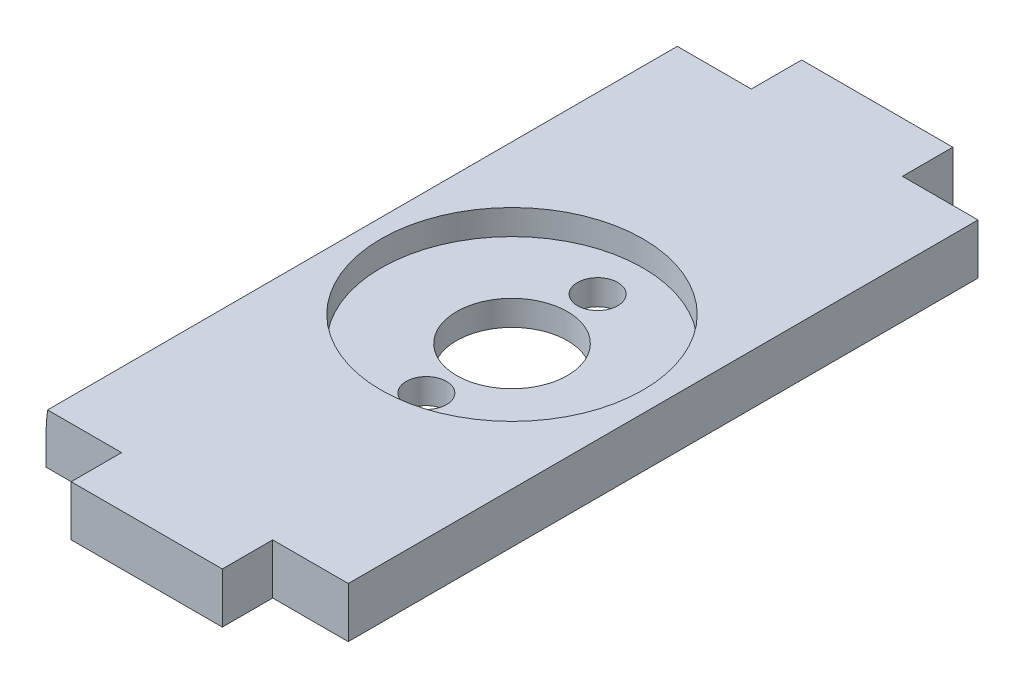
ISO-10303-21;
HEADER;
FILE_DESCRIPTION(('STEP AP214'),'2;1');
FILE_NAME('part.step','',(''),(''),'','','');
FILE_SCHEMA(('AUTOMOTIVE_DESIGN { 1 0 10303 214 1 1 1 1 }'));
ENDSEC;
DATA;
#1=APPLICATION_CONTEXT('core data for automotive mechanical design processes');
#2=APPLICATION_PROTOCOL_DEFINITION('international standard','automotive_design',2000,#1);
#3=PRODUCT_CONTEXT('',#1,'mechanical');
#4=PRODUCT('Part','Part','',(#3));
#5=PRODUCT_RELATED_PRODUCT_CATEGORY('part','',(#4));
#6=PRODUCT_DEFINITION_FORMATION('','',#4);
#7=PRODUCT_DEFINITION_CONTEXT('part definition',#1,'design');
#8=PRODUCT_DEFINITION('design','',#6,#7);
#9=PRODUCT_DEFINITION_SHAPE('','',#8);
#10=(LENGTH_UNIT() NAMED_UNIT(*) SI_UNIT(.MILLI.,.METRE.));
#11=(NAMED_UNIT(*) PLANE_ANGLE_UNIT() SI_UNIT($,.RADIAN.));
#12=(NAMED_UNIT(*) SI_UNIT($,.STERADIAN.) SOLID_ANGLE_UNIT());
#13=UNCERTAINTY_MEASURE_WITH_UNIT(LENGTH_MEASURE(1.E-05),#10,'distance_accuracy_value','');
#14=(GEOMETRIC_REPRESENTATION_CONTEXT(3) GLOBAL_UNCERTAINTY_ASSIGNED_CONTEXT((#13)) GLOBAL_UNIT_ASSIGNED_CONTEXT((#10,
#11,#12)) REPRESENTATION_CONTEXT('',''));
#15=CARTESIAN_POINT('',(0.,0.,0.));
#16=DIRECTION('',(0.,0.,1.));
#17=DIRECTION('',(1.,0.,0.));
#18=AXIS2_PLACEMENT_3D('',#15,#16,#17);
#19=CARTESIAN_POINT('',(0.,5.,0.));
#20=DIRECTION('',(0.,-1.,0.));
#21=DIRECTION('',(0.,0.,-1.));
#22=AXIS2_PLACEMENT_3D('',#19,#20,#21);
#23=CYLINDRICAL_SURFACE('',#22,5.5);
#24=CARTESIAN_POINT('',(0.,0.,0.));
#25=DIRECTION('',(0.,1.,0.));
#26=DIRECTION('',(0.,0.,1.));
#27=AXIS2_PLACEMENT_3D('',#24,#25,#26);
#28=CIRCLE('',#27,5.5);
#29=CARTESIAN_POINT('',(0.,0.,5.5));
#30=VERTEX_POINT('',#29);
#31=EDGE_CURVE('E177',#30,#30,#28,.T.);
#32=ORIENTED_EDGE('',*,*,#31,.F.);
#33=EDGE_LOOP('',(#32));
#34=FACE_BOUND('',#33,.T.);
#35=CARTESIAN_POINT('',(0.,2.5,0.));
#36=DIRECTION('',(0.,1.,0.));
#37=DIRECTION('',(0.,0.,1.));
#38=AXIS2_PLACEMENT_3D('',#35,#36,#37);
#39=CIRCLE('',#38,5.5);
#40=CARTESIAN_POINT('',(0.,2.5,5.5));
#41=VERTEX_POINT('',#40);
#42=EDGE_CURVE('E310',#41,#41,#39,.T.);
#43=ORIENTED_EDGE('',*,*,#42,.T.);
#44=EDGE_LOOP('',(#43));
#45=FACE_BOUND('',#44,.T.);
#46=ADVANCED_FACE('F38',(#34,#45),#23,.F.);
#47=CARTESIAN_POINT('',(0.,5.,-8.5));
#48=DIRECTION('',(0.,-1.,0.));
#49=DIRECTION('',(0.,0.,-1.));
#50=AXIS2_PLACEMENT_3D('',#47,#48,#49);
#51=CYLINDRICAL_SURFACE('',#50,2.);
#52=CARTESIAN_POINT('',(0.,0.,-8.5));
#53=DIRECTION('',(0.,1.,0.));
#54=DIRECTION('',(0.,0.,1.));
#55=AXIS2_PLACEMENT_3D('',#52,#53,#54);
#56=CIRCLE('',#55,2.);
#57=CARTESIAN_POINT('',(0.,0.,-6.5));
#58=VERTEX_POINT('',#57);
#59=EDGE_CURVE('E302',#58,#58,#56,.T.);
#60=ORIENTED_EDGE('',*,*,#59,.F.);
#61=EDGE_LOOP('',(#60));
#62=FACE_BOUND('',#61,.T.);
#63=CARTESIAN_POINT('',(0.,2.5,-8.5));
#64=DIRECTION('',(0.,1.,0.));
#65=DIRECTION('',(0.,0.,1.));
#66=AXIS2_PLACEMENT_3D('',#63,#64,#65);
#67=CIRCLE('',#66,2.);
#68=CARTESIAN_POINT('',(0.,2.5,-6.5));
#69=VERTEX_POINT('',#68);
#70=EDGE_CURVE('E314',#69,#69,#67,.T.);
#71=ORIENTED_EDGE('',*,*,#70,.T.);
#72=EDGE_LOOP('',(#71));
#73=FACE_BOUND('',#72,.T.);
#74=ADVANCED_FACE('F355',(#62,#73),#51,.F.);
#75=CARTESIAN_POINT('',(0.,5.,8.5));
#76=DIRECTION('',(0.,-1.,0.));
#77=DIRECTION('',(0.,0.,-1.));
#78=AXIS2_PLACEMENT_3D('',#75,#76,#77);
#79=CYLINDRICAL_SURFACE('',#78,2.);
#80=CARTESIAN_POINT('',(0.,0.,8.5));
#81=DIRECTION('',(0.,1.,0.));
#82=DIRECTION('',(0.,0.,1.));
#83=AXIS2_PLACEMENT_3D('',#80,#81,#82);
#84=CIRCLE('',#83,2.);
#85=CARTESIAN_POINT('',(0.,0.,10.5));
#86=VERTEX_POINT('',#85);
#87=EDGE_CURVE('E306',#86,#86,#84,.T.);
#88=ORIENTED_EDGE('',*,*,#87,.F.);
#89=EDGE_LOOP('',(#88));
#90=FACE_BOUND('',#89,.T.);
#91=CARTESIAN_POINT('',(0.,2.5,8.5));
#92=DIRECTION('',(0.,1.,0.));
#93=DIRECTION('',(0.,0.,1.));
#94=AXIS2_PLACEMENT_3D('',#91,#92,#93);
#95=CIRCLE('',#94,2.);
#96=CARTESIAN_POINT('',(0.,2.5,10.5));
#97=VERTEX_POINT('',#96);
#98=EDGE_CURVE('E42',#97,#97,#95,.T.);
#99=ORIENTED_EDGE('',*,*,#98,.T.);
#100=EDGE_LOOP('',(#99));
#101=FACE_BOUND('',#100,.T.);
#102=ADVANCED_FACE('F361',(#90,#101),#79,.F.);
#103=CARTESIAN_POINT('',(0.,5.,0.));
#104=DIRECTION('',(0.,1.,0.));
#105=DIRECTION('',(0.,0.,1.));
#106=AXIS2_PLACEMENT_3D('',#103,#104,#105);
#107=PLANE('',#106);
#108=DIRECTION('',(0.,0.,1.));
#109=VECTOR('',#108,1.);
#110=CARTESIAN_POINT('',(-14.8431348329844,5.,-33.7549165017267));
#111=LINE('',#110,#109);
#112=CARTESIAN_POINT('',(-14.8431348329844,5.,-31.25));
#113=VERTEX_POINT('',#112);
#114=CARTESIAN_POINT('',(-14.8431348329844,5.,31.25));
#115=VERTEX_POINT('',#114);
#116=EDGE_CURVE('E328',#113,#115,#111,.T.);
#117=ORIENTED_EDGE('',*,*,#116,.T.);
#118=DIRECTION('',(1.,0.,0.));
#119=VECTOR('',#118,1.);
#120=CARTESIAN_POINT('',(-15.,5.,31.25));
#121=LINE('',#120,#119);
#122=CARTESIAN_POINT('',(-7.5,5.,31.25));
#123=VERTEX_POINT('',#122);
#124=EDGE_CURVE('E267',#115,#123,#121,.T.);
#125=ORIENTED_EDGE('',*,*,#124,.T.);
#126=DIRECTION('',(0.,0.,1.));
#127=VECTOR('',#126,1.);
#128=CARTESIAN_POINT('',(-7.5,5.,31.25));
#129=LINE('',#128,#127);
#130=CARTESIAN_POINT('',(-7.5,5.,36.25));
#131=VERTEX_POINT('',#130);
#132=EDGE_CURVE('E272',#123,#131,#129,.T.);
#133=ORIENTED_EDGE('',*,*,#132,.T.);
#134=DIRECTION('',(1.,0.,0.));
#135=VECTOR('',#134,1.);
#136=CARTESIAN_POINT('',(-7.5,5.,36.25));
#137=LINE('',#136,#135);
#138=CARTESIAN_POINT('',(7.5,5.,36.25));
#139=VERTEX_POINT('',#138);
#140=EDGE_CURVE('E147',#131,#139,#137,.T.);
#141=ORIENTED_EDGE('',*,*,#140,.T.);
#142=DIRECTION('',(0.,0.,-1.));
#143=VECTOR('',#142,1.);
#144=CARTESIAN_POINT('',(7.5,5.,31.25));
#145=LINE('',#144,#143);
#146=CARTESIAN_POINT('',(7.5,5.,31.25));
#147=VERTEX_POINT('',#146);
#148=EDGE_CURVE('E138',#139,#147,#145,.T.);
#149=ORIENTED_EDGE('',*,*,#148,.T.);
#150=DIRECTION('',(1.,0.,0.));
#151=VECTOR('',#150,1.);
#152=CARTESIAN_POINT('',(7.5,5.,31.25));
#153=LINE('',#152,#151);
#154=CARTESIAN_POINT('',(15.,5.,31.25));
#155=VERTEX_POINT('',#154);
#156=EDGE_CURVE('E144',#147,#155,#153,.T.);
#157=ORIENTED_EDGE('',*,*,#156,.T.);
#158=DIRECTION('',(0.,0.,-1.));
#159=VECTOR('',#158,1.);
#160=CARTESIAN_POINT('',(15.,5.,31.25));
#161=LINE('',#160,#159);
#162=CARTESIAN_POINT('',(15.,5.,-31.25));
#163=VERTEX_POINT('',#162);
#164=EDGE_CURVE('E64',#155,#163,#161,.T.);
#165=ORIENTED_EDGE('',*,*,#164,.T.);
#166=DIRECTION('',(-1.,0.,0.));
#167=VECTOR('',#166,1.);
#168=CARTESIAN_POINT('',(7.5,5.,-31.25));
#169=LINE('',#168,#167);
#170=CARTESIAN_POINT('',(7.5,5.,-31.25));
#171=VERTEX_POINT('',#170);
#172=EDGE_CURVE('E210',#163,#171,#169,.T.);
#173=ORIENTED_EDGE('',*,*,#172,.T.);
#174=DIRECTION('',(0.,0.,-1.));
#175=VECTOR('',#174,1.);
#176=CARTESIAN_POINT('',(7.5,5.,-31.25));
#177=LINE('',#176,#175);
#178=CARTESIAN_POINT('',(7.5,5.,-36.25));
#179=VERTEX_POINT('',#178);
#180=EDGE_CURVE('E117',#171,#179,#177,.T.);
#181=ORIENTED_EDGE('',*,*,#180,.T.);
#182=DIRECTION('',(-1.,0.,0.));
#183=VECTOR('',#182,1.);
#184=CARTESIAN_POINT('',(-7.5,5.,-36.25));
#185=LINE('',#184,#183);
#186=CARTESIAN_POINT('',(-7.5,5.,-36.25));
#187=VERTEX_POINT('',#186);
#188=EDGE_CURVE('E246',#179,#187,#185,.T.);
#189=ORIENTED_EDGE('',*,*,#188,.T.);
#190=DIRECTION('',(0.,0.,1.));
#191=VECTOR('',#190,1.);
#192=CARTESIAN_POINT('',(-7.5,5.,-31.25));
#193=LINE('',#192,#191);
#194=CARTESIAN_POINT('',(-7.5,5.,-31.25));
#195=VERTEX_POINT('',#194);
#196=EDGE_CURVE('E268',#187,#195,#193,.T.);
#197=ORIENTED_EDGE('',*,*,#196,.T.);
#198=DIRECTION('',(-1.,0.,0.));
#199=VECTOR('',#198,1.);
#200=CARTESIAN_POINT('',(-15.,5.,-31.25));
#201=LINE('',#200,#199);
#202=EDGE_CURVE('E264',#195,#113,#201,.T.);
#203=ORIENTED_EDGE('',*,*,#202,.T.);
#204=EDGE_LOOP('',(#117,#125,#133,#141,#149,#157,#165,#173,#181,#189,#197,#203));
#205=FACE_BOUND('',#204,.T.);
#206=CARTESIAN_POINT('',(0.,5.,0.));
#207=DIRECTION('',(0.,1.,0.));
#208=DIRECTION('',(0.,0.,1.));
#209=AXIS2_PLACEMENT_3D('',#206,#207,#208);
#210=CIRCLE('',#209,13.);
#211=CARTESIAN_POINT('',(0.,5.,13.));
#212=VERTEX_POINT('',#211);
#213=EDGE_CURVE('E318',#212,#212,#210,.T.);
#214=ORIENTED_EDGE('',*,*,#213,.F.);
#215=EDGE_LOOP('',(#214));
#216=FACE_BOUND('',#215,.T.);
#217=ADVANCED_FACE('F141',(#205,#216),#107,.T.);
#218=CARTESIAN_POINT('',(0.,0.,0.));
#219=DIRECTION('',(0.,1.,0.));
#220=DIRECTION('',(0.,0.,1.));
#221=AXIS2_PLACEMENT_3D('',#218,#219,#220);
#222=PLANE('',#221);
#223=DIRECTION('',(-1.,0.,0.));
#224=VECTOR('',#223,1.);
#225=CARTESIAN_POINT('',(7.5,0.,-31.25));
#226=LINE('',#225,#224);
#227=CARTESIAN_POINT('',(15.,0.,-31.25));
#228=VERTEX_POINT('',#227);
#229=CARTESIAN_POINT('',(7.5,0.,-31.25));
#230=VERTEX_POINT('',#229);
#231=EDGE_CURVE('E172',#228,#230,#226,.T.);
#232=ORIENTED_EDGE('',*,*,#231,.F.);
#233=DIRECTION('',(0.,0.,-1.));
#234=VECTOR('',#233,1.);
#235=CARTESIAN_POINT('',(15.,0.,31.25));
#236=LINE('',#235,#234);
#237=CARTESIAN_POINT('',(15.,0.,31.25));
#238=VERTEX_POINT('',#237);
#239=EDGE_CURVE('E109',#238,#228,#236,.T.);
#240=ORIENTED_EDGE('',*,*,#239,.F.);
#241=DIRECTION('',(1.,0.,0.));
#242=VECTOR('',#241,1.);
#243=CARTESIAN_POINT('',(7.5,0.,31.25));
#244=LINE('',#243,#242);
#245=CARTESIAN_POINT('',(7.5,0.,31.25));
#246=VERTEX_POINT('',#245);
#247=EDGE_CURVE('E205',#246,#238,#244,.T.);
#248=ORIENTED_EDGE('',*,*,#247,.F.);
#249=DIRECTION('',(0.,0.,-1.));
#250=VECTOR('',#249,1.);
#251=CARTESIAN_POINT('',(7.5,0.,31.25));
#252=LINE('',#251,#250);
#253=CARTESIAN_POINT('',(7.5,0.,36.25));
#254=VERTEX_POINT('',#253);
#255=EDGE_CURVE('E157',#254,#246,#252,.T.);
#256=ORIENTED_EDGE('',*,*,#255,.F.);
#257=DIRECTION('',(1.,0.,0.));
#258=VECTOR('',#257,1.);
#259=CARTESIAN_POINT('',(-7.5,0.,36.25));
#260=LINE('',#259,#258);
#261=CARTESIAN_POINT('',(-7.5,0.,36.25));
#262=VERTEX_POINT('',#261);
#263=EDGE_CURVE('E200',#262,#254,#260,.T.);
#264=ORIENTED_EDGE('',*,*,#263,.F.);
#265=DIRECTION('',(0.,0.,1.));
#266=VECTOR('',#265,1.);
#267=CARTESIAN_POINT('',(-7.5,0.,31.25));
#268=LINE('',#267,#266);
#269=CARTESIAN_POINT('',(-7.5,0.,31.25));
#270=VERTEX_POINT('',#269);
#271=EDGE_CURVE('E197',#270,#262,#268,.T.);
#272=ORIENTED_EDGE('',*,*,#271,.F.);
#273=DIRECTION('',(1.,0.,0.));
#274=VECTOR('',#273,1.);
#275=CARTESIAN_POINT('',(-15.,0.,31.25));
#276=LINE('',#275,#274);
#277=CARTESIAN_POINT('',(-15.,0.,31.25));
#278=VERTEX_POINT('',#277);
#279=EDGE_CURVE('E194',#278,#270,#276,.T.);
#280=ORIENTED_EDGE('',*,*,#279,.F.);
#281=DIRECTION('',(0.,0.,1.));
#282=VECTOR('',#281,1.);
#283=CARTESIAN_POINT('',(-15.,0.,31.25));
#284=LINE('',#283,#282);
#285=CARTESIAN_POINT('',(-15.,0.,-31.25));
#286=VERTEX_POINT('',#285);
#287=EDGE_CURVE('E190',#286,#278,#284,.T.);
#288=ORIENTED_EDGE('',*,*,#287,.F.);
#289=DIRECTION('',(-1.,0.,0.));
#290=VECTOR('',#289,1.);
#291=CARTESIAN_POINT('',(-15.,0.,-31.25));
#292=LINE('',#291,#290);
#293=CARTESIAN_POINT('',(-7.5,0.,-31.25));
#294=VERTEX_POINT('',#293);
#295=EDGE_CURVE('E186',#294,#286,#292,.T.);
#296=ORIENTED_EDGE('',*,*,#295,.F.);
#297=DIRECTION('',(0.,0.,1.));
#298=VECTOR('',#297,1.);
#299=CARTESIAN_POINT('',(-7.5,0.,-31.25));
#300=LINE('',#299,#298);
#301=CARTESIAN_POINT('',(-7.5,0.,-36.25));
#302=VERTEX_POINT('',#301);
#303=EDGE_CURVE('E183',#302,#294,#300,.T.);
#304=ORIENTED_EDGE('',*,*,#303,.F.);
#305=DIRECTION('',(-1.,0.,0.));
#306=VECTOR('',#305,1.);
#307=CARTESIAN_POINT('',(-7.5,0.,-36.25));
#308=LINE('',#307,#306);
#309=CARTESIAN_POINT('',(7.5,0.,-36.25));
#310=VERTEX_POINT('',#309);
#311=EDGE_CURVE('E180',#310,#302,#308,.T.);
#312=ORIENTED_EDGE('',*,*,#311,.F.);
#313=DIRECTION('',(0.,0.,-1.));
#314=VECTOR('',#313,1.);
#315=CARTESIAN_POINT('',(7.5,0.,-31.25));
#316=LINE('',#315,#314);
#317=EDGE_CURVE('E176',#230,#310,#316,.T.);
#318=ORIENTED_EDGE('',*,*,#317,.F.);
#319=EDGE_LOOP('',(#232,#240,#248,#256,#264,#272,#280,#288,#296,#304,#312,#318));
#320=FACE_BOUND('',#319,.T.);
#321=ORIENTED_EDGE('',*,*,#31,.T.);
#322=EDGE_LOOP('',(#321));
#323=FACE_BOUND('',#322,.T.);
#324=ORIENTED_EDGE('',*,*,#59,.T.);
#325=EDGE_LOOP('',(#324));
#326=FACE_BOUND('',#325,.T.);
#327=ORIENTED_EDGE('',*,*,#87,.T.);
#328=EDGE_LOOP('',(#327));
#329=FACE_BOUND('',#328,.T.);
#330=ADVANCED_FACE('F250',(#320,#323,#326,#329),#222,.F.);
#331=CARTESIAN_POINT('',(7.5,5.,-31.25));
#332=DIRECTION('',(0.,0.,1.));
#333=DIRECTION('',(1.,0.,0.));
#334=AXIS2_PLACEMENT_3D('',#331,#332,#333);
#335=PLANE('',#334);
#336=ORIENTED_EDGE('',*,*,#231,.T.);
#337=DIRECTION('',(0.,-1.,0.));
#338=VECTOR('',#337,1.);
#339=CARTESIAN_POINT('',(7.5,5.,-31.25));
#340=LINE('',#339,#338);
#341=EDGE_CURVE('E11',#171,#230,#340,.T.);
#342=ORIENTED_EDGE('',*,*,#341,.F.);
#343=ORIENTED_EDGE('',*,*,#172,.F.);
#344=DIRECTION('',(0.,-1.,0.));
#345=VECTOR('',#344,1.);
#346=CARTESIAN_POINT('',(15.,5.,-31.25));
#347=LINE('',#346,#345);
#348=EDGE_CURVE('E168',#163,#228,#347,.T.);
#349=ORIENTED_EDGE('',*,*,#348,.T.);
#350=EDGE_LOOP('',(#336,#342,#343,#349));
#351=FACE_BOUND('',#350,.T.);
#352=ADVANCED_FACE('F40',(#351),#335,.F.);
#353=CARTESIAN_POINT('',(7.5,5.,-31.25));
#354=DIRECTION('',(-1.,0.,0.));
#355=DIRECTION('',(0.,0.,1.));
#356=AXIS2_PLACEMENT_3D('',#353,#354,#355);
#357=PLANE('',#356);
#358=ORIENTED_EDGE('',*,*,#317,.T.);
#359=DIRECTION('',(0.,-1.,0.));
#360=VECTOR('',#359,1.);
#361=CARTESIAN_POINT('',(7.5,5.,-36.25));
#362=LINE('',#361,#360);
#363=EDGE_CURVE('E48',#179,#310,#362,.T.);
#364=ORIENTED_EDGE('',*,*,#363,.F.);
#365=ORIENTED_EDGE('',*,*,#180,.F.);
#366=ORIENTED_EDGE('',*,*,#341,.T.);
#367=EDGE_LOOP('',(#358,#364,#365,#366));
#368=FACE_BOUND('',#367,.T.);
#369=ADVANCED_FACE('F459',(#368),#357,.F.);
#370=CARTESIAN_POINT('',(-7.5,5.,-36.25));
#371=DIRECTION('',(0.,0.,1.));
#372=DIRECTION('',(1.,0.,0.));
#373=AXIS2_PLACEMENT_3D('',#370,#371,#372);
#374=PLANE('',#373);
#375=ORIENTED_EDGE('',*,*,#311,.T.);
#376=DIRECTION('',(0.,-1.,0.));
#377=VECTOR('',#376,1.);
#378=CARTESIAN_POINT('',(-7.5,5.,-36.25));
#379=LINE('',#378,#377);
#380=EDGE_CURVE('E235',#187,#302,#379,.T.);
#381=ORIENTED_EDGE('',*,*,#380,.F.);
#382=ORIENTED_EDGE('',*,*,#188,.F.);
#383=ORIENTED_EDGE('',*,*,#363,.T.);
#384=EDGE_LOOP('',(#375,#381,#382,#383));
#385=FACE_BOUND('',#384,.T.);
#386=ADVANCED_FACE('F244',(#385),#374,.F.);
#387=CARTESIAN_POINT('',(-7.5,5.,-31.25));
#388=DIRECTION('',(1.,0.,0.));
#389=DIRECTION('',(0.,0.,-1.));
#390=AXIS2_PLACEMENT_3D('',#387,#388,#389);
#391=PLANE('',#390);
#392=ORIENTED_EDGE('',*,*,#303,.T.);
#393=DIRECTION('',(0.,-1.,0.));
#394=VECTOR('',#393,1.);
#395=CARTESIAN_POINT('',(-7.5,5.,-31.25));
#396=LINE('',#395,#394);
#397=EDGE_CURVE('E231',#195,#294,#396,.T.);
#398=ORIENTED_EDGE('',*,*,#397,.F.);
#399=ORIENTED_EDGE('',*,*,#196,.F.);
#400=ORIENTED_EDGE('',*,*,#380,.T.);
#401=EDGE_LOOP('',(#392,#398,#399,#400));
#402=FACE_BOUND('',#401,.T.);
#403=ADVANCED_FACE('F256',(#402),#391,.F.);
#404=CARTESIAN_POINT('',(-15.,5.,-31.25));
#405=DIRECTION('',(0.,0.,1.));
#406=DIRECTION('',(1.,0.,0.));
#407=AXIS2_PLACEMENT_3D('',#404,#405,#406);
#408=PLANE('',#407);
#409=DIRECTION('',(0.,-1.,0.));
#410=VECTOR('',#409,1.);
#411=CARTESIAN_POINT('',(-15.,5.,-31.25));
#412=LINE('',#411,#410);
#413=CARTESIAN_POINT('',(-15.,2.5,-31.25));
#414=VERTEX_POINT('',#413);
#415=EDGE_CURVE('E228',#414,#286,#412,.T.);
#416=ORIENTED_EDGE('',*,*,#415,.F.);
#417=CARTESIAN_POINT('',(5.,2.5,-31.25));
#418=DIRECTION('',(0.,0.,1.));
#419=DIRECTION('',(1.,0.,0.));
#420=AXIS2_PLACEMENT_3D('',#417,#418,#419);
#421=CIRCLE('',#420,20.);
#422=EDGE_CURVE('E265',#113,#414,#421,.T.);
#423=ORIENTED_EDGE('',*,*,#422,.F.);
#424=ORIENTED_EDGE('',*,*,#202,.F.);
#425=ORIENTED_EDGE('',*,*,#397,.T.);
#426=ORIENTED_EDGE('',*,*,#295,.T.);
#427=EDGE_LOOP('',(#416,#423,#424,#425,#426));
#428=FACE_BOUND('',#427,.T.);
#429=ADVANCED_FACE('F261',(#428),#408,.F.);
#430=CARTESIAN_POINT('',(-15.,5.,31.25));
#431=DIRECTION('',(1.,0.,0.));
#432=DIRECTION('',(0.,0.,-1.));
#433=AXIS2_PLACEMENT_3D('',#430,#431,#432);
#434=PLANE('',#433);
#435=DIRECTION('',(0.,-1.,0.));
#436=VECTOR('',#435,1.);
#437=CARTESIAN_POINT('',(-15.,5.,31.25));
#438=LINE('',#437,#436);
#439=CARTESIAN_POINT('',(-15.,2.5,31.25));
#440=VERTEX_POINT('',#439);
#441=EDGE_CURVE('E225',#440,#278,#438,.T.);
#442=ORIENTED_EDGE('',*,*,#441,.F.);
#443=DIRECTION('',(0.,0.,1.));
#444=VECTOR('',#443,1.);
#445=CARTESIAN_POINT('',(-15.,2.5,-33.7549165017267));
#446=LINE('',#445,#444);
#447=EDGE_CURVE('E55',#414,#440,#446,.T.);
#448=ORIENTED_EDGE('',*,*,#447,.F.);
#449=ORIENTED_EDGE('',*,*,#415,.T.);
#450=ORIENTED_EDGE('',*,*,#287,.T.);
#451=EDGE_LOOP('',(#442,#448,#449,#450));
#452=FACE_BOUND('',#451,.T.);
#453=ADVANCED_FACE('F341',(#452),#434,.F.);
#454=CARTESIAN_POINT('',(-15.,5.,31.25));
#455=DIRECTION('',(0.,0.,-1.));
#456=DIRECTION('',(-1.,0.,0.));
#457=AXIS2_PLACEMENT_3D('',#454,#455,#456);
#458=PLANE('',#457);
#459=ORIENTED_EDGE('',*,*,#124,.F.);
#460=CARTESIAN_POINT('',(5.,2.5,31.25));
#461=DIRECTION('',(0.,0.,-1.));
#462=DIRECTION('',(1.,0.,0.));
#463=AXIS2_PLACEMENT_3D('',#460,#461,#462);
#464=CIRCLE('',#463,20.);
#465=EDGE_CURVE('E329',#440,#115,#464,.T.);
#466=ORIENTED_EDGE('',*,*,#465,.F.);
#467=ORIENTED_EDGE('',*,*,#441,.T.);
#468=ORIENTED_EDGE('',*,*,#279,.T.);
#469=DIRECTION('',(0.,-1.,0.));
#470=VECTOR('',#469,1.);
#471=CARTESIAN_POINT('',(-7.5,5.,31.25));
#472=LINE('',#471,#470);
#473=EDGE_CURVE('E221',#123,#270,#472,.T.);
#474=ORIENTED_EDGE('',*,*,#473,.F.);
#475=EDGE_LOOP('',(#459,#466,#467,#468,#474));
#476=FACE_BOUND('',#475,.T.);
#477=ADVANCED_FACE('F344',(#476),#458,.F.);
#478=CARTESIAN_POINT('',(-7.5,5.,31.25));
#479=DIRECTION('',(1.,0.,0.));
#480=DIRECTION('',(0.,0.,-1.));
#481=AXIS2_PLACEMENT_3D('',#478,#479,#480);
#482=PLANE('',#481);
#483=ORIENTED_EDGE('',*,*,#271,.T.);
#484=DIRECTION('',(0.,-1.,0.));
#485=VECTOR('',#484,1.);
#486=CARTESIAN_POINT('',(-7.5,5.,36.25));
#487=LINE('',#486,#485);
#488=EDGE_CURVE('E217',#131,#262,#487,.T.);
#489=ORIENTED_EDGE('',*,*,#488,.F.);
#490=ORIENTED_EDGE('',*,*,#132,.F.);
#491=ORIENTED_EDGE('',*,*,#473,.T.);
#492=EDGE_LOOP('',(#483,#489,#490,#491));
#493=FACE_BOUND('',#492,.T.);
#494=ADVANCED_FACE('F284',(#493),#482,.F.);
#495=CARTESIAN_POINT('',(-7.5,5.,36.25));
#496=DIRECTION('',(0.,0.,-1.));
#497=DIRECTION('',(-1.,0.,0.));
#498=AXIS2_PLACEMENT_3D('',#495,#496,#497);
#499=PLANE('',#498);
#500=ORIENTED_EDGE('',*,*,#263,.T.);
#501=DIRECTION('',(0.,-1.,0.));
#502=VECTOR('',#501,1.);
#503=CARTESIAN_POINT('',(7.5,5.,36.25));
#504=LINE('',#503,#502);
#505=EDGE_CURVE('E161',#139,#254,#504,.T.);
#506=ORIENTED_EDGE('',*,*,#505,.F.);
#507=ORIENTED_EDGE('',*,*,#140,.F.);
#508=ORIENTED_EDGE('',*,*,#488,.T.);
#509=EDGE_LOOP('',(#500,#506,#507,#508));
#510=FACE_BOUND('',#509,.T.);
#511=ADVANCED_FACE('F288',(#510),#499,.F.);
#512=CARTESIAN_POINT('',(7.5,5.,31.25));
#513=DIRECTION('',(-1.,0.,0.));
#514=DIRECTION('',(0.,0.,1.));
#515=AXIS2_PLACEMENT_3D('',#512,#513,#514);
#516=PLANE('',#515);
#517=ORIENTED_EDGE('',*,*,#255,.T.);
#518=DIRECTION('',(0.,-1.,0.));
#519=VECTOR('',#518,1.);
#520=CARTESIAN_POINT('',(7.5,5.,31.25));
#521=LINE('',#520,#519);
#522=EDGE_CURVE('E154',#147,#246,#521,.T.);
#523=ORIENTED_EDGE('',*,*,#522,.F.);
#524=ORIENTED_EDGE('',*,*,#148,.F.);
#525=ORIENTED_EDGE('',*,*,#505,.T.);
#526=EDGE_LOOP('',(#517,#523,#524,#525));
#527=FACE_BOUND('',#526,.T.);
#528=ADVANCED_FACE('F155',(#527),#516,.F.);
#529=CARTESIAN_POINT('',(7.5,5.,31.25));
#530=DIRECTION('',(0.,0.,-1.));
#531=DIRECTION('',(-1.,0.,0.));
#532=AXIS2_PLACEMENT_3D('',#529,#530,#531);
#533=PLANE('',#532);
#534=ORIENTED_EDGE('',*,*,#247,.T.);
#535=DIRECTION('',(0.,-1.,0.));
#536=VECTOR('',#535,1.);
#537=CARTESIAN_POINT('',(15.,5.,31.25));
#538=LINE('',#537,#536);
#539=EDGE_CURVE('E162',#155,#238,#538,.T.);
#540=ORIENTED_EDGE('',*,*,#539,.F.);
#541=ORIENTED_EDGE('',*,*,#156,.F.);
#542=ORIENTED_EDGE('',*,*,#522,.T.);
#543=EDGE_LOOP('',(#534,#540,#541,#542));
#544=FACE_BOUND('',#543,.T.);
#545=ADVANCED_FACE('F164',(#544),#533,.F.);
#546=CARTESIAN_POINT('',(15.,5.,31.25));
#547=DIRECTION('',(-1.,0.,0.));
#548=DIRECTION('',(0.,0.,1.));
#549=AXIS2_PLACEMENT_3D('',#546,#547,#548);
#550=PLANE('',#549);
#551=ORIENTED_EDGE('',*,*,#239,.T.);
#552=ORIENTED_EDGE('',*,*,#348,.F.);
#553=ORIENTED_EDGE('',*,*,#164,.F.);
#554=ORIENTED_EDGE('',*,*,#539,.T.);
#555=EDGE_LOOP('',(#551,#552,#553,#554));
#556=FACE_BOUND('',#555,.T.);
#557=ADVANCED_FACE('F289',(#556),#550,.F.);
#558=CARTESIAN_POINT('',(0.,2.5,0.));
#559=DIRECTION('',(0.,1.,0.));
#560=DIRECTION('',(0.,0.,1.));
#561=AXIS2_PLACEMENT_3D('',#558,#559,#560);
#562=CYLINDRICAL_SURFACE('',#561,13.);
#563=CARTESIAN_POINT('',(0.,2.5,0.));
#564=DIRECTION('',(0.,1.,0.));
#565=DIRECTION('',(0.,0.,1.));
#566=AXIS2_PLACEMENT_3D('',#563,#564,#565);
#567=CIRCLE('',#566,13.);
#568=CARTESIAN_POINT('',(0.,2.5,13.));
#569=VERTEX_POINT('',#568);
#570=EDGE_CURVE('E322',#569,#569,#567,.T.);
#571=ORIENTED_EDGE('',*,*,#570,.F.);
#572=EDGE_LOOP('',(#571));
#573=FACE_BOUND('',#572,.T.);
#574=ORIENTED_EDGE('',*,*,#213,.T.);
#575=EDGE_LOOP('',(#574));
#576=FACE_BOUND('',#575,.T.);
#577=ADVANCED_FACE('F374',(#573,#576),#562,.F.);
#578=CARTESIAN_POINT('',(0.,2.5,0.));
#579=DIRECTION('',(0.,1.,0.));
#580=DIRECTION('',(0.,0.,1.));
#581=AXIS2_PLACEMENT_3D('',#578,#579,#580);
#582=PLANE('',#581);
#583=ORIENTED_EDGE('',*,*,#42,.F.);
#584=EDGE_LOOP('',(#583));
#585=FACE_BOUND('',#584,.T.);
#586=ORIENTED_EDGE('',*,*,#70,.F.);
#587=EDGE_LOOP('',(#586));
#588=FACE_BOUND('',#587,.T.);
#589=ORIENTED_EDGE('',*,*,#98,.F.);
#590=EDGE_LOOP('',(#589));
#591=FACE_BOUND('',#590,.T.);
#592=ORIENTED_EDGE('',*,*,#570,.T.);
#593=EDGE_LOOP('',(#592));
#594=FACE_BOUND('',#593,.T.);
#595=ADVANCED_FACE('F402',(#585,#588,#591,#594),#582,.T.);
#596=CARTESIAN_POINT('',(5.,2.5,-33.7549165017267));
#597=DIRECTION('',(0.,0.,1.));
#598=DIRECTION('',(1.,0.,0.));
#599=AXIS2_PLACEMENT_3D('',#596,#597,#598);
#600=CYLINDRICAL_SURFACE('',#599,20.);
#601=ORIENTED_EDGE('',*,*,#422,.T.);
#602=ORIENTED_EDGE('',*,*,#447,.T.);
#603=ORIENTED_EDGE('',*,*,#465,.T.);
#604=ORIENTED_EDGE('',*,*,#116,.F.);
#605=EDGE_LOOP('',(#601,#602,#603,#604));
#606=FACE_BOUND('',#605,.T.);
#607=ADVANCED_FACE('F337',(#606),#600,.T.);
#608=CLOSED_SHELL('',(#46,#74,#102,#217,#330,#352,#369,#386,#403,#429,#453,#477,#494,#511,#528,
#545,#557,#577,#595,#607));
#609=MANIFOLD_SOLID_BREP('B2',#608);
#610=ADVANCED_BREP_SHAPE_REPRESENTATION('',(#18,#609),#14);
#611=SHAPE_DEFINITION_REPRESENTATION(#9,#610);
ENDSEC;
END-ISO-10303-21;
